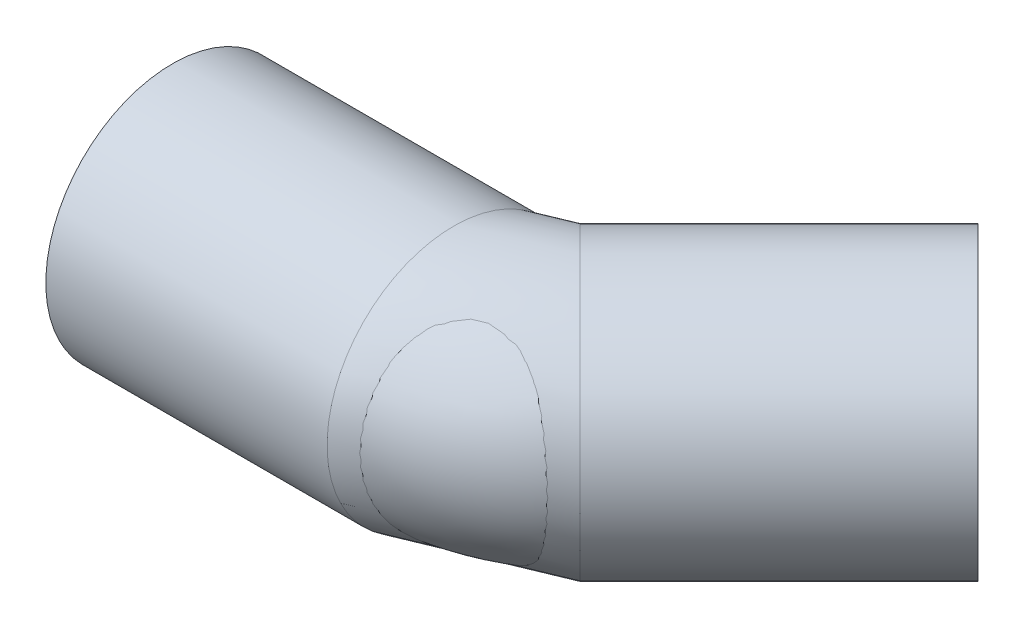
ISO-10303-21;
HEADER;
FILE_DESCRIPTION(('STEP AP214'),'2;1');
FILE_NAME('part.step','',(''),(''),'','','');
FILE_SCHEMA(('AUTOMOTIVE_DESIGN { 1 0 10303 214 1 1 1 1 }'));
ENDSEC;
DATA;
#1=APPLICATION_CONTEXT('core data for automotive mechanical design processes');
#2=APPLICATION_PROTOCOL_DEFINITION('international standard','automotive_design',2000,#1);
#3=PRODUCT_CONTEXT('',#1,'mechanical');
#4=PRODUCT('Part','Part','',(#3));
#5=PRODUCT_RELATED_PRODUCT_CATEGORY('part','',(#4));
#6=PRODUCT_DEFINITION_FORMATION('','',#4);
#7=PRODUCT_DEFINITION_CONTEXT('part definition',#1,'design');
#8=PRODUCT_DEFINITION('design','',#6,#7);
#9=PRODUCT_DEFINITION_SHAPE('','',#8);
#10=(LENGTH_UNIT() NAMED_UNIT(*) SI_UNIT(.MILLI.,.METRE.));
#11=(NAMED_UNIT(*) PLANE_ANGLE_UNIT() SI_UNIT($,.RADIAN.));
#12=(NAMED_UNIT(*) SI_UNIT($,.STERADIAN.) SOLID_ANGLE_UNIT());
#13=UNCERTAINTY_MEASURE_WITH_UNIT(LENGTH_MEASURE(1.E-05),#10,'distance_accuracy_value','');
#14=(GEOMETRIC_REPRESENTATION_CONTEXT(3) GLOBAL_UNCERTAINTY_ASSIGNED_CONTEXT((#13)) GLOBAL_UNIT_ASSIGNED_CONTEXT((#10,
#11,#12)) REPRESENTATION_CONTEXT('',''));
#15=CARTESIAN_POINT('',(0.,0.,0.));
#16=DIRECTION('',(0.,0.,1.));
#17=DIRECTION('',(1.,0.,0.));
#18=AXIS2_PLACEMENT_3D('',#15,#16,#17);
#19=CARTESIAN_POINT('',(0.,0.,0.));
#20=DIRECTION('',(1.,0.,0.));
#21=DIRECTION('',(0.,0.,-1.));
#22=AXIS2_PLACEMENT_3D('',#19,#20,#21);
#23=CYLINDRICAL_SURFACE('',#22,45.);
#24=CARTESIAN_POINT('',(100.,0.,0.));
#25=DIRECTION('',(1.,0.,0.));
#26=DIRECTION('',(0.,0.,-1.));
#27=AXIS2_PLACEMENT_3D('',#24,#25,#26);
#28=CIRCLE('',#27,45.);
#29=CARTESIAN_POINT('',(100.,0.,-45.));
#30=VERTEX_POINT('',#29);
#31=EDGE_CURVE('E56',#30,#30,#28,.T.);
#32=ORIENTED_EDGE('',*,*,#31,.F.);
#33=EDGE_LOOP('',(#32));
#34=FACE_BOUND('',#33,.T.);
#35=CARTESIAN_POINT('',(0.,0.,0.));
#36=DIRECTION('',(1.,0.,0.));
#37=DIRECTION('',(0.,0.,-1.));
#38=AXIS2_PLACEMENT_3D('',#35,#36,#37);
#39=CIRCLE('',#38,45.);
#40=CARTESIAN_POINT('',(0.,0.,-45.));
#41=VERTEX_POINT('',#40);
#42=EDGE_CURVE('E61',#41,#41,#39,.T.);
#43=ORIENTED_EDGE('',*,*,#42,.T.);
#44=EDGE_LOOP('',(#43));
#45=FACE_BOUND('',#44,.T.);
#46=ADVANCED_FACE('F43',(#34,#45),#23,.T.);
#47=CARTESIAN_POINT('',(100.,0.,-45.));
#48=DIRECTION('',(0.,1.,0.));
#49=DIRECTION('',(0.,0.,1.));
#50=AXIS2_PLACEMENT_3D('',#47,#48,#49);
#51=TOROIDAL_SURFACE('',#50,45.,45.);
#52=CARTESIAN_POINT('',(131.819805153395,0.,-13.1801948466054));
#53=DIRECTION('',(0.707106781186546,0.,-0.707106781186549));
#54=DIRECTION('',(-0.707106781186549,0.,-0.707106781186546));
#55=AXIS2_PLACEMENT_3D('',#52,#53,#54);
#56=CIRCLE('',#55,45.);
#57=EDGE_CURVE('E47',#30,#30,#56,.T.);
#58=ORIENTED_EDGE('',*,*,#57,.F.);
#59=ORIENTED_EDGE('',*,*,#31,.T.);
#60=EDGE_LOOP('',(#58,#59));
#61=FACE_BOUND('',#60,.T.);
#62=ADVANCED_FACE('F86',(#61),#51,.T.);
#63=CARTESIAN_POINT('',(131.819805153395,0.,-13.1801948466054));
#64=DIRECTION('',(0.707106781186546,0.,-0.707106781186549));
#65=DIRECTION('',(-0.707106781186549,0.,-0.707106781186546));
#66=AXIS2_PLACEMENT_3D('',#63,#64,#65);
#67=CYLINDRICAL_SURFACE('',#66,45.);
#68=CARTESIAN_POINT('',(202.530483272049,0.,-83.8908729652603));
#69=DIRECTION('',(0.707106781186546,0.,-0.707106781186549));
#70=DIRECTION('',(-0.707106781186549,0.,-0.707106781186546));
#71=AXIS2_PLACEMENT_3D('',#68,#69,#70);
#72=CIRCLE('',#71,45.);
#73=CARTESIAN_POINT('',(170.710678118655,0.,-115.710678118655));
#74=VERTEX_POINT('',#73);
#75=EDGE_CURVE('E65',#74,#74,#72,.T.);
#76=ORIENTED_EDGE('',*,*,#75,.F.);
#77=EDGE_LOOP('',(#76));
#78=FACE_BOUND('',#77,.T.);
#79=ORIENTED_EDGE('',*,*,#57,.T.);
#80=EDGE_LOOP('',(#79));
#81=FACE_BOUND('',#80,.T.);
#82=ADVANCED_FACE('F45',(#78,#81),#67,.T.);
#83=CARTESIAN_POINT('',(0.,0.,0.));
#84=DIRECTION('',(1.,0.,0.));
#85=DIRECTION('',(0.,0.,-1.));
#86=AXIS2_PLACEMENT_3D('',#83,#84,#85);
#87=PLANE('',#86);
#88=CARTESIAN_POINT('',(0.,0.,0.));
#89=DIRECTION('',(1.,0.,0.));
#90=DIRECTION('',(0.,0.,-1.));
#91=AXIS2_PLACEMENT_3D('',#88,#89,#90);
#92=CIRCLE('',#91,42.);
#93=CARTESIAN_POINT('',(0.,0.,-42.));
#94=VERTEX_POINT('',#93);
#95=EDGE_CURVE('E67',#94,#94,#92,.F.);
#96=ORIENTED_EDGE('',*,*,#95,.F.);
#97=EDGE_LOOP('',(#96));
#98=FACE_BOUND('',#97,.T.);
#99=ORIENTED_EDGE('',*,*,#42,.F.);
#100=EDGE_LOOP('',(#99));
#101=FACE_BOUND('',#100,.T.);
#102=ADVANCED_FACE('F79',(#98,#101),#87,.F.);
#103=CARTESIAN_POINT('',(202.530483272049,0.,-83.8908729652603));
#104=DIRECTION('',(0.707106781186546,0.,-0.707106781186549));
#105=DIRECTION('',(-0.707106781186549,0.,-0.707106781186546));
#106=AXIS2_PLACEMENT_3D('',#103,#104,#105);
#107=PLANE('',#106);
#108=CARTESIAN_POINT('',(202.530483272049,0.,-83.8908729652603));
#109=DIRECTION('',(0.707106781186546,0.,-0.707106781186549));
#110=DIRECTION('',(-0.707106781186549,0.,-0.707106781186546));
#111=AXIS2_PLACEMENT_3D('',#108,#109,#110);
#112=CIRCLE('',#111,42.);
#113=CARTESIAN_POINT('',(172.831998462214,0.,-113.589357775095));
#114=VERTEX_POINT('',#113);
#115=EDGE_CURVE('E11',#114,#114,#112,.F.);
#116=ORIENTED_EDGE('',*,*,#115,.T.);
#117=EDGE_LOOP('',(#116));
#118=FACE_BOUND('',#117,.T.);
#119=ORIENTED_EDGE('',*,*,#75,.T.);
#120=EDGE_LOOP('',(#119));
#121=FACE_BOUND('',#120,.T.);
#122=ADVANCED_FACE('F82',(#118,#121),#107,.T.);
#123=CARTESIAN_POINT('',(0.,0.,0.));
#124=DIRECTION('',(1.,0.,0.));
#125=DIRECTION('',(0.,0.,-1.));
#126=AXIS2_PLACEMENT_3D('',#123,#124,#125);
#127=CYLINDRICAL_SURFACE('',#126,42.);
#128=CARTESIAN_POINT('',(100.,0.,0.));
#129=DIRECTION('',(1.,0.,0.));
#130=DIRECTION('',(0.,0.,-1.));
#131=AXIS2_PLACEMENT_3D('',#128,#129,#130);
#132=CIRCLE('',#131,42.);
#133=CARTESIAN_POINT('',(100.,0.,42.));
#134=VERTEX_POINT('',#133);
#135=EDGE_CURVE('E71',#134,#134,#132,.F.);
#136=ORIENTED_EDGE('',*,*,#135,.F.);
#137=EDGE_LOOP('',(#136));
#138=FACE_BOUND('',#137,.T.);
#139=ORIENTED_EDGE('',*,*,#95,.T.);
#140=EDGE_LOOP('',(#139));
#141=FACE_BOUND('',#140,.T.);
#142=ADVANCED_FACE('F77',(#138,#141),#127,.F.);
#143=CARTESIAN_POINT('',(100.,0.,-45.));
#144=DIRECTION('',(0.,1.,0.));
#145=DIRECTION('',(0.,0.,1.));
#146=AXIS2_PLACEMENT_3D('',#143,#144,#145);
#147=TOROIDAL_SURFACE('',#146,45.,42.);
#148=CARTESIAN_POINT('',(131.819805153395,0.,-13.1801948466054));
#149=DIRECTION('',(0.707106781186546,0.,-0.707106781186549));
#150=DIRECTION('',(-0.707106781186549,0.,-0.707106781186546));
#151=AXIS2_PLACEMENT_3D('',#148,#149,#150);
#152=CIRCLE('',#151,42.);
#153=CARTESIAN_POINT('',(161.51828996323,0.,16.5182899632295));
#154=VERTEX_POINT('',#153);
#155=EDGE_CURVE('E51',#154,#154,#152,.F.);
#156=CARTESIAN_POINT('',(100.,0.,-45.));
#157=DIRECTION('',(0.,1.,0.));
#158=DIRECTION('',(0.,0.,1.));
#159=AXIS2_PLACEMENT_3D('',#156,#157,#158);
#160=CIRCLE('',#159,87.);
#161=EDGE_CURVE('',#134,#154,#160,.T.);
#162=ORIENTED_EDGE('',*,*,#135,.T.);
#163=ORIENTED_EDGE('',*,*,#155,.F.);
#164=ORIENTED_EDGE('',*,*,#161,.T.);
#165=ORIENTED_EDGE('',*,*,#161,.F.);
#166=EDGE_LOOP('',(#162,#164,#163,#165));
#167=FACE_BOUND('',#166,.T.);
#168=ADVANCED_FACE('F93',(#167),#147,.F.);
#169=CARTESIAN_POINT('',(131.819805153395,0.,-13.1801948466054));
#170=DIRECTION('',(0.707106781186546,0.,-0.707106781186549));
#171=DIRECTION('',(-0.707106781186549,0.,-0.707106781186546));
#172=AXIS2_PLACEMENT_3D('',#169,#170,#171);
#173=CYLINDRICAL_SURFACE('',#172,42.);
#174=ORIENTED_EDGE('',*,*,#115,.F.);
#175=EDGE_LOOP('',(#174));
#176=FACE_BOUND('',#175,.T.);
#177=ORIENTED_EDGE('',*,*,#155,.T.);
#178=EDGE_LOOP('',(#177));
#179=FACE_BOUND('',#178,.T.);
#180=ADVANCED_FACE('F91',(#176,#179),#173,.F.);
#181=CLOSED_SHELL('',(#46,#62,#82,#102,#122,#142,#168,#180));
#182=MANIFOLD_SOLID_BREP('B2',#181);
#183=ADVANCED_BREP_SHAPE_REPRESENTATION('',(#18,#182),#14);
#184=SHAPE_DEFINITION_REPRESENTATION(#9,#183);
ENDSEC;
END-ISO-10303-21;
